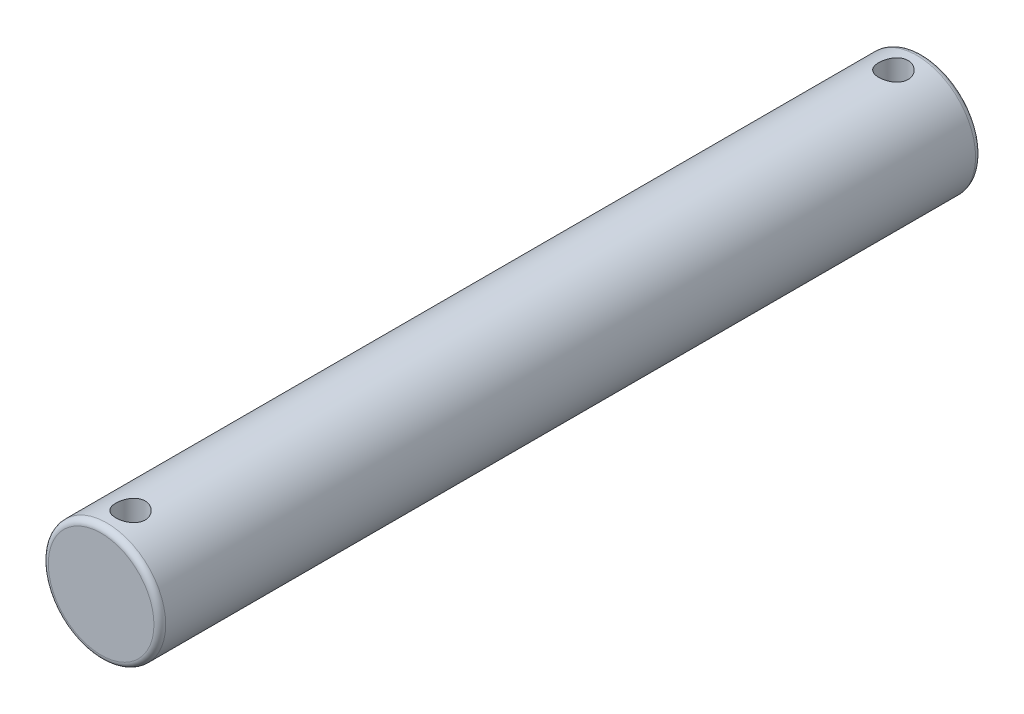
ISO-10303-21;
HEADER;
FILE_DESCRIPTION(('STEP AP214'),'2;1');
FILE_NAME('part.step','',(''),(''),'','','');
FILE_SCHEMA(('AUTOMOTIVE_DESIGN { 1 0 10303 214 1 1 1 1 }'));
ENDSEC;
DATA;
#1=APPLICATION_CONTEXT('core data for automotive mechanical design processes');
#2=APPLICATION_PROTOCOL_DEFINITION('international standard','automotive_design',2000,#1);
#3=PRODUCT_CONTEXT('',#1,'mechanical');
#4=PRODUCT('Part','Part','',(#3));
#5=PRODUCT_RELATED_PRODUCT_CATEGORY('part','',(#4));
#6=PRODUCT_DEFINITION_FORMATION('','',#4);
#7=PRODUCT_DEFINITION_CONTEXT('part definition',#1,'design');
#8=PRODUCT_DEFINITION('design','',#6,#7);
#9=PRODUCT_DEFINITION_SHAPE('','',#8);
#10=(LENGTH_UNIT() NAMED_UNIT(*) SI_UNIT(.MILLI.,.METRE.));
#11=(NAMED_UNIT(*) PLANE_ANGLE_UNIT() SI_UNIT($,.RADIAN.));
#12=(NAMED_UNIT(*) SI_UNIT($,.STERADIAN.) SOLID_ANGLE_UNIT());
#13=UNCERTAINTY_MEASURE_WITH_UNIT(LENGTH_MEASURE(1.E-05),#10,'distance_accuracy_value','');
#14=(GEOMETRIC_REPRESENTATION_CONTEXT(3) GLOBAL_UNCERTAINTY_ASSIGNED_CONTEXT((#13)) GLOBAL_UNIT_ASSIGNED_CONTEXT((#10,
#11,#12)) REPRESENTATION_CONTEXT('',''));
#15=CARTESIAN_POINT('',(0.,0.,0.));
#16=DIRECTION('',(0.,0.,1.));
#17=DIRECTION('',(1.,0.,0.));
#18=AXIS2_PLACEMENT_3D('',#15,#16,#17);
#19=CARTESIAN_POINT('',(0.,0.,140.));
#20=DIRECTION('',(0.,0.,-1.));
#21=DIRECTION('',(-1.,0.,0.));
#22=AXIS2_PLACEMENT_3D('',#19,#20,#21);
#23=CYLINDRICAL_SURFACE('',#22,10.);
#24=CARTESIAN_POINT('',(0.,0.,1.));
#25=DIRECTION('',(0.,0.,1.));
#26=DIRECTION('',(1.,0.,0.));
#27=AXIS2_PLACEMENT_3D('',#24,#25,#26);
#28=CIRCLE('',#27,10.);
#29=CARTESIAN_POINT('',(10.,0.,1.));
#30=VERTEX_POINT('',#29);
#31=EDGE_CURVE('E59',#30,#30,#28,.T.);
#32=ORIENTED_EDGE('',*,*,#31,.T.);
#33=EDGE_LOOP('',(#32));
#34=FACE_BOUND('',#33,.T.);
#35=CARTESIAN_POINT('',(0.,0.,139.));
#36=DIRECTION('',(0.,0.,1.));
#37=DIRECTION('',(1.,0.,0.));
#38=AXIS2_PLACEMENT_3D('',#35,#36,#37);
#39=CIRCLE('',#38,10.);
#40=CARTESIAN_POINT('',(10.,0.,139.));
#41=VERTEX_POINT('',#40);
#42=EDGE_CURVE('E105',#41,#41,#39,.F.);
#43=ORIENTED_EDGE('',*,*,#42,.T.);
#44=EDGE_LOOP('',(#43));
#45=FACE_BOUND('',#44,.T.);
#46=CARTESIAN_POINT('',(0.,-10.,132.5));
#47=CARTESIAN_POINT('',(0.138126814449551,-9.99999766446687,132.50000387623));
#48=CARTESIAN_POINT('',(0.276296929717937,-9.99710963553043,132.511485917956));
#49=CARTESIAN_POINT('',(0.54867720628422,-9.98586856383157,132.557041918845));
#50=CARTESIAN_POINT('',(0.682885078117898,-9.97751242366627,132.591128682563));
#51=CARTESIAN_POINT('',(0.943368120304289,-9.9562604388672,132.680732089103));
#52=CARTESIAN_POINT('',(1.06965260571666,-9.94337004736764,132.736222997859));
#53=CARTESIAN_POINT('',(1.3111202198407,-9.91442239679369,132.866968983408));
#54=CARTESIAN_POINT('',(1.4263029739146,-9.89836503090261,132.942224726865));
#55=CARTESIAN_POINT('',(1.64466987883486,-9.86445689319489,133.11200131609));
#56=CARTESIAN_POINT('',(1.74759281676842,-9.84657845246877,133.206852624932));
#57=CARTESIAN_POINT('',(1.93624821200553,-9.81122700196561,133.412420341515));
#58=CARTESIAN_POINT('',(2.02197872824865,-9.79375403816446,133.523138538245));
#59=CARTESIAN_POINT('',(2.17504423799828,-9.76091292830281,133.759325377895));
#60=CARTESIAN_POINT('',(2.24208702654189,-9.74557990774685,133.884988718015));
#61=CARTESIAN_POINT('',(2.35399484758457,-9.71915824696694,134.146247352767));
#62=CARTESIAN_POINT('',(2.39886342573357,-9.70806892824031,134.281841055553));
#63=CARTESIAN_POINT('',(2.46425806134127,-9.69167461160538,134.556239163669));
#64=CARTESIAN_POINT('',(2.48525378055342,-9.68625818328352,134.69492482673));
#65=CARTESIAN_POINT('',(2.50376962511068,-9.68148937432652,134.973947614999));
#66=CARTESIAN_POINT('',(2.50129356969686,-9.68213600713214,135.11428446782));
#67=CARTESIAN_POINT('',(2.47331087439951,-9.68932009194695,135.389026346242));
#68=CARTESIAN_POINT('',(2.44836390031772,-9.69571438345489,135.523492702442));
#69=CARTESIAN_POINT('',(2.37704031150499,-9.71344516118448,135.786268418185));
#70=CARTESIAN_POINT('',(2.33066217011567,-9.72478199948731,135.914577338382));
#71=CARTESIAN_POINT('',(2.21731579656199,-9.75125189842765,136.162896693754));
#72=CARTESIAN_POINT('',(2.15014444538822,-9.76642212449693,136.282810286316));
#73=CARTESIAN_POINT('',(1.99726046002493,-9.79882851409985,136.509864516261));
#74=CARTESIAN_POINT('',(1.91154458134808,-9.81606503891046,136.617002913445));
#75=CARTESIAN_POINT('',(1.72110570780206,-9.85126467566485,136.818672692824));
#76=CARTESIAN_POINT('',(1.61591043027646,-9.86923449130001,136.912757483436));
#77=CARTESIAN_POINT('',(1.3910198625062,-9.90343275964593,137.082035404106));
#78=CARTESIAN_POINT('',(1.27132412951326,-9.91966115915679,137.157227957106));
#79=CARTESIAN_POINT('',(1.02019314780232,-9.94862886823651,137.286750977041));
#80=CARTESIAN_POINT('',(0.88871898868104,-9.96135600212879,137.341008900424));
#81=CARTESIAN_POINT('',(0.618126680238133,-9.98179861652361,137.426528842849));
#82=CARTESIAN_POINT('',(0.479009998584134,-9.98951505565468,137.457795260697));
#83=CARTESIAN_POINT('',(0.200899950650036,-9.99892498785624,137.495762609265));
#84=CARTESIAN_POINT('',(0.0619945333136756,-10.0007675584713,137.503071710126));
#85=CARTESIAN_POINT('',(-0.215054791335852,-9.99864674690754,137.494584996574));
#86=CARTESIAN_POINT('',(-0.353198766074329,-9.99468388736421,137.478791262001));
#87=CARTESIAN_POINT('',(-0.622690447960822,-9.98149301878918,137.425048486014));
#88=CARTESIAN_POINT('',(-0.754108531614593,-9.97234390309647,137.387431227538));
#89=CARTESIAN_POINT('',(-1.00876215408754,-9.94981177723595,137.291488193286));
#90=CARTESIAN_POINT('',(-1.13199686505443,-9.93642833949965,137.233160326145));
#91=CARTESIAN_POINT('',(-1.36920522404971,-9.9065551321037,137.096273118542));
#92=CARTESIAN_POINT('',(-1.48297573639292,-9.89001445611,137.017373146006));
#93=CARTESIAN_POINT('',(-1.6958776894055,-9.85574181979587,136.842016818671));
#94=CARTESIAN_POINT('',(-1.79500659828873,-9.83800965421578,136.745557433971));
#95=CARTESIAN_POINT('',(-1.97831761345413,-9.80281594932498,136.534996731927));
#96=CARTESIAN_POINT('',(-2.06207311270183,-9.78537173637463,136.420520495001));
#97=CARTESIAN_POINT('',(-2.20918459835604,-9.75321463970069,136.178778942552));
#98=CARTESIAN_POINT('',(-2.27254149026901,-9.73850163474941,136.051514195049));
#99=CARTESIAN_POINT('',(-2.37658570101224,-9.71363491194665,135.788490462656));
#100=CARTESIAN_POINT('',(-2.41740732773931,-9.70345425375809,135.652787286146));
#101=CARTESIAN_POINT('',(-2.47557609990489,-9.68877906706586,135.376150603575));
#102=CARTESIAN_POINT('',(-2.49292837912652,-9.68428329504044,135.235218248298));
#103=CARTESIAN_POINT('',(-2.50339765056083,-9.68158168701612,134.956464960231));
#104=CARTESIAN_POINT('',(-2.49719649630132,-9.68319887888034,134.818670941456));
#105=CARTESIAN_POINT('',(-2.46229546385366,-9.69213181672143,134.546160185556));
#106=CARTESIAN_POINT('',(-2.43359603781099,-9.69944744817731,134.411443386645));
#107=CARTESIAN_POINT('',(-2.35488553240495,-9.71885434473222,134.149652568224));
#108=CARTESIAN_POINT('',(-2.30500234113404,-9.73091692061057,134.022537824599));
#109=CARTESIAN_POINT('',(-2.18544152267504,-9.7584625954084,133.778391028811));
#110=CARTESIAN_POINT('',(-2.11576115005696,-9.77394616867808,133.661360378022));
#111=CARTESIAN_POINT('',(-1.95644624772859,-9.80709390439337,133.437408951663));
#112=CARTESIAN_POINT('',(-1.86633860485377,-9.82480441386302,133.330831544293));
#113=CARTESIAN_POINT('',(-1.66964895198288,-9.86013378743769,133.134088258674));
#114=CARTESIAN_POINT('',(-1.56306303543523,-9.87775262878422,133.043926283145));
#115=CARTESIAN_POINT('',(-1.33411264450431,-9.91129426079449,132.880981152392));
#116=CARTESIAN_POINT('',(-1.21149737052731,-9.92718055609783,132.808542310547));
#117=CARTESIAN_POINT('',(-0.955443432517468,-9.95508208291861,132.685420895099));
#118=CARTESIAN_POINT('',(-0.822012605727906,-9.96710008666301,132.634722732252));
#119=CARTESIAN_POINT('',(-0.574017088739129,-9.98413432609236,132.564046949451));
#120=CARTESIAN_POINT('',(-0.460633618180125,-9.99004308421151,132.540081261578));
#121=CARTESIAN_POINT('',(-0.231510119227147,-9.9979767538658,132.50805676063));
#122=CARTESIAN_POINT('',(-0.115770268737698,-10.0000019575149,132.499996751158));
#123=CARTESIAN_POINT('',(0.,-10.,132.5));
#124=B_SPLINE_CURVE_WITH_KNOTS('',3,(#46,#47,#48,#49,#50,#51,#52,#53,#54,#55,#56,#57,#58,#59,
#60,#61,#62,#63,#64,#65,#66,#67,#68,#69,#70,#71,#72,#73,#74,#75,#76,#77,#78,#79,#80,#81,#82,#83,
#84,#85,#86,#87,#88,#89,#90,#91,#92,#93,#94,#95,#96,#97,#98,#99,#100,#101,#102,#103,#104,#105,
#106,#107,#108,#109,#110,#111,#112,#113,#114,#115,#116,#117,#118,#119,#120,#121,#122,#123),
.UNSPECIFIED.,.T.,.F.,(4,2,2,2,2,2,2,2,2,2,2,2,2,2,2,2,2,2,2,2,2,2,2,2,2,2,2,2,2,2,2,2,2,2,2,2,
2,2,4),(0.,0.413956187453146,0.828147062939834,1.24184150381016,1.65554990028221,
2.07690725728564,2.4983121596677,2.92597745909673,3.35357435282281,3.77260491835115,
4.19156730193363,4.6003749501723,5.0092117244893,5.42217546461997,5.83521151399138,
6.26002501620561,6.68485149269279,7.11113715020726,7.53734122819941,7.95263848254329,
8.3678983519344,8.77700457528932,9.18615212209352,9.60255979281118,10.0190393835223,
10.4457418201299,10.8724253125472,11.2965375769764,11.7205570543047,12.1323963400749,
12.5442273493652,12.9536066760888,13.3630428023797,13.7831596069298,14.2033761629383,
14.6312030917578,15.0587227304538,15.4057040491338,15.752659267482),.UNSPECIFIED.);
#125=CARTESIAN_POINT('',(0.,-10.,132.5));
#126=VERTEX_POINT('',#125);
#127=EDGE_CURVE('E63',#126,#126,#124,.T.);
#128=ORIENTED_EDGE('',*,*,#127,.F.);
#129=EDGE_LOOP('',(#128));
#130=FACE_BOUND('',#129,.T.);
#131=CARTESIAN_POINT('',(0.,10.,132.5));
#132=CARTESIAN_POINT('',(-0.138126814449551,9.99999766446687,132.50000387623));
#133=CARTESIAN_POINT('',(-0.276296929717937,9.99710963553043,132.511485917956));
#134=CARTESIAN_POINT('',(-0.54867720628422,9.98586856383157,132.557041918845));
#135=CARTESIAN_POINT('',(-0.682885078117898,9.97751242366627,132.591128682563));
#136=CARTESIAN_POINT('',(-0.943368120304289,9.9562604388672,132.680732089103));
#137=CARTESIAN_POINT('',(-1.06965260571666,9.94337004736764,132.736222997859));
#138=CARTESIAN_POINT('',(-1.3111202198407,9.91442239679369,132.866968983408));
#139=CARTESIAN_POINT('',(-1.4263029739146,9.89836503090261,132.942224726865));
#140=CARTESIAN_POINT('',(-1.64466987883486,9.86445689319489,133.11200131609));
#141=CARTESIAN_POINT('',(-1.74759281676842,9.84657845246877,133.206852624932));
#142=CARTESIAN_POINT('',(-1.93624821200553,9.81122700196561,133.412420341515));
#143=CARTESIAN_POINT('',(-2.02197872824865,9.79375403816446,133.523138538245));
#144=CARTESIAN_POINT('',(-2.17504423799828,9.76091292830281,133.759325377895));
#145=CARTESIAN_POINT('',(-2.24208702654189,9.74557990774685,133.884988718015));
#146=CARTESIAN_POINT('',(-2.35399484758457,9.71915824696694,134.146247352767));
#147=CARTESIAN_POINT('',(-2.39886342573357,9.70806892824031,134.281841055553));
#148=CARTESIAN_POINT('',(-2.46425806134127,9.69167461160538,134.556239163669));
#149=CARTESIAN_POINT('',(-2.48525378055342,9.68625818328352,134.69492482673));
#150=CARTESIAN_POINT('',(-2.50376962511068,9.68148937432652,134.973947614999));
#151=CARTESIAN_POINT('',(-2.50129356969686,9.68213600713214,135.11428446782));
#152=CARTESIAN_POINT('',(-2.47331087439951,9.68932009194695,135.389026346242));
#153=CARTESIAN_POINT('',(-2.44836390031772,9.69571438345489,135.523492702442));
#154=CARTESIAN_POINT('',(-2.37704031150499,9.71344516118448,135.786268418185));
#155=CARTESIAN_POINT('',(-2.33066217011567,9.72478199948731,135.914577338382));
#156=CARTESIAN_POINT('',(-2.21731579656199,9.75125189842765,136.162896693754));
#157=CARTESIAN_POINT('',(-2.15014444538822,9.76642212449693,136.282810286316));
#158=CARTESIAN_POINT('',(-1.99726046002493,9.79882851409985,136.509864516261));
#159=CARTESIAN_POINT('',(-1.91154458134808,9.81606503891046,136.617002913445));
#160=CARTESIAN_POINT('',(-1.72110570780206,9.85126467566485,136.818672692824));
#161=CARTESIAN_POINT('',(-1.61591043027646,9.86923449130001,136.912757483436));
#162=CARTESIAN_POINT('',(-1.3910198625062,9.90343275964593,137.082035404106));
#163=CARTESIAN_POINT('',(-1.27132412951326,9.91966115915679,137.157227957106));
#164=CARTESIAN_POINT('',(-1.02019314780232,9.94862886823651,137.286750977041));
#165=CARTESIAN_POINT('',(-0.88871898868104,9.96135600212879,137.341008900424));
#166=CARTESIAN_POINT('',(-0.618126680238133,9.98179861652361,137.426528842849));
#167=CARTESIAN_POINT('',(-0.479009998584134,9.98951505565468,137.457795260697));
#168=CARTESIAN_POINT('',(-0.200899950650036,9.99892498785624,137.495762609265));
#169=CARTESIAN_POINT('',(-0.0619945333136756,10.0007675584713,137.503071710126));
#170=CARTESIAN_POINT('',(0.215054791335852,9.99864674690754,137.494584996574));
#171=CARTESIAN_POINT('',(0.353198766074329,9.99468388736421,137.478791262001));
#172=CARTESIAN_POINT('',(0.622690447960822,9.98149301878918,137.425048486014));
#173=CARTESIAN_POINT('',(0.754108531614593,9.97234390309647,137.387431227538));
#174=CARTESIAN_POINT('',(1.00876215408754,9.94981177723595,137.291488193286));
#175=CARTESIAN_POINT('',(1.13199686505443,9.93642833949965,137.233160326145));
#176=CARTESIAN_POINT('',(1.36920522404971,9.9065551321037,137.096273118542));
#177=CARTESIAN_POINT('',(1.48297573639292,9.89001445611,137.017373146006));
#178=CARTESIAN_POINT('',(1.6958776894055,9.85574181979587,136.842016818671));
#179=CARTESIAN_POINT('',(1.79500659828873,9.83800965421578,136.745557433971));
#180=CARTESIAN_POINT('',(1.97831761345413,9.80281594932498,136.534996731927));
#181=CARTESIAN_POINT('',(2.06207311270183,9.78537173637463,136.420520495001));
#182=CARTESIAN_POINT('',(2.20918459835604,9.75321463970069,136.178778942552));
#183=CARTESIAN_POINT('',(2.27254149026901,9.73850163474941,136.051514195049));
#184=CARTESIAN_POINT('',(2.37658570101224,9.71363491194665,135.788490462656));
#185=CARTESIAN_POINT('',(2.41740732773931,9.70345425375809,135.652787286146));
#186=CARTESIAN_POINT('',(2.47557609990489,9.68877906706586,135.376150603575));
#187=CARTESIAN_POINT('',(2.49292837912652,9.68428329504044,135.235218248298));
#188=CARTESIAN_POINT('',(2.50339765056083,9.68158168701612,134.956464960231));
#189=CARTESIAN_POINT('',(2.49719649630132,9.68319887888034,134.818670941456));
#190=CARTESIAN_POINT('',(2.46229546385366,9.69213181672143,134.546160185556));
#191=CARTESIAN_POINT('',(2.43359603781099,9.69944744817731,134.411443386645));
#192=CARTESIAN_POINT('',(2.35488553240495,9.71885434473222,134.149652568224));
#193=CARTESIAN_POINT('',(2.30500234113404,9.73091692061057,134.022537824599));
#194=CARTESIAN_POINT('',(2.18544152267504,9.7584625954084,133.778391028811));
#195=CARTESIAN_POINT('',(2.11576115005696,9.77394616867808,133.661360378022));
#196=CARTESIAN_POINT('',(1.95644624772859,9.80709390439337,133.437408951663));
#197=CARTESIAN_POINT('',(1.86633860485377,9.82480441386302,133.330831544293));
#198=CARTESIAN_POINT('',(1.66964895198288,9.86013378743769,133.134088258674));
#199=CARTESIAN_POINT('',(1.56306303543523,9.87775262878422,133.043926283145));
#200=CARTESIAN_POINT('',(1.33411264450431,9.91129426079449,132.880981152392));
#201=CARTESIAN_POINT('',(1.21149737052731,9.92718055609783,132.808542310547));
#202=CARTESIAN_POINT('',(0.955443432517468,9.95508208291861,132.685420895099));
#203=CARTESIAN_POINT('',(0.822012605727906,9.96710008666301,132.634722732252));
#204=CARTESIAN_POINT('',(0.574017088739129,9.98413432609236,132.564046949451));
#205=CARTESIAN_POINT('',(0.460633618180125,9.99004308421151,132.540081261578));
#206=CARTESIAN_POINT('',(0.231510119227147,9.9979767538658,132.50805676063));
#207=CARTESIAN_POINT('',(0.115770268737698,10.0000019575149,132.499996751158));
#208=CARTESIAN_POINT('',(0.,10.,132.5));
#209=B_SPLINE_CURVE_WITH_KNOTS('',3,(#131,#132,#133,#134,#135,#136,#137,#138,#139,#140,#141,
#142,#143,#144,#145,#146,#147,#148,#149,#150,#151,#152,#153,#154,#155,#156,#157,#158,#159,#160,
#161,#162,#163,#164,#165,#166,#167,#168,#169,#170,#171,#172,#173,#174,#175,#176,#177,#178,#179,
#180,#181,#182,#183,#184,#185,#186,#187,#188,#189,#190,#191,#192,#193,#194,#195,#196,#197,#198,
#199,#200,#201,#202,#203,#204,#205,#206,#207,#208),.UNSPECIFIED.,.T.,.F.,(4,2,2,2,2,2,2,2,2,2,2,
2,2,2,2,2,2,2,2,2,2,2,2,2,2,2,2,2,2,2,2,2,2,2,2,2,2,2,4),(0.,0.413956187453146,
0.828147062939834,1.24184150381016,1.65554990028221,2.07690725728564,2.4983121596677,
2.92597745909673,3.35357435282281,3.77260491835115,4.19156730193363,4.6003749501723,
5.0092117244893,5.42217546461997,5.83521151399138,6.26002501620561,6.68485149269279,
7.11113715020726,7.53734122819941,7.95263848254329,8.3678983519344,8.77700457528932,
9.18615212209352,9.60255979281118,10.0190393835223,10.4457418201299,10.8724253125472,
11.2965375769764,11.7205570543047,12.1323963400749,12.5442273493652,12.9536066760888,
13.3630428023797,13.7831596069298,14.2033761629383,14.6312030917578,15.0587227304538,
15.4057040491338,15.752659267482),.UNSPECIFIED.);
#210=CARTESIAN_POINT('',(0.,10.,132.5));
#211=VERTEX_POINT('',#210);
#212=EDGE_CURVE('E71',#211,#211,#209,.T.);
#213=ORIENTED_EDGE('',*,*,#212,.F.);
#214=EDGE_LOOP('',(#213));
#215=FACE_BOUND('',#214,.T.);
#216=CARTESIAN_POINT('',(0.,-10.,2.5));
#217=CARTESIAN_POINT('',(0.138126814449552,-9.99999766446687,2.50000387623026));
#218=CARTESIAN_POINT('',(0.276296929717939,-9.99710963553044,2.51148591795631));
#219=CARTESIAN_POINT('',(0.548677206284221,-9.98586856383157,2.55704191884501));
#220=CARTESIAN_POINT('',(0.682885078117899,-9.97751242366627,2.59112868256308));
#221=CARTESIAN_POINT('',(0.943368120304295,-9.9562604388672,2.68073208910348));
#222=CARTESIAN_POINT('',(1.06965260571667,-9.94337004736764,2.73622299785878));
#223=CARTESIAN_POINT('',(1.31112021984071,-9.91442239679369,2.86696898340807));
#224=CARTESIAN_POINT('',(1.42630297391461,-9.89836503090261,2.94222472686495));
#225=CARTESIAN_POINT('',(1.64466987883486,-9.86445689319489,3.1120013160903));
#226=CARTESIAN_POINT('',(1.74759281676843,-9.84657845246877,3.20685262493177));
#227=CARTESIAN_POINT('',(1.93624821200553,-9.8112270019656,3.41242034151506));
#228=CARTESIAN_POINT('',(2.02197872824865,-9.79375403816446,3.52313853824489));
#229=CARTESIAN_POINT('',(2.17504423799829,-9.76091292830281,3.75932537789498));
#230=CARTESIAN_POINT('',(2.2420870265419,-9.74557990774685,3.88498871801455));
#231=CARTESIAN_POINT('',(2.35399484758457,-9.71915824696694,4.14624735276672));
#232=CARTESIAN_POINT('',(2.39886342573357,-9.70806892824031,4.28184105555336));
#233=CARTESIAN_POINT('',(2.46425806134127,-9.69167461160538,4.55623916366943));
#234=CARTESIAN_POINT('',(2.48525378055342,-9.68625818328352,4.69492482672999));
#235=CARTESIAN_POINT('',(2.50376962511068,-9.68148937432652,4.97394761499891));
#236=CARTESIAN_POINT('',(2.50129356969685,-9.68213600713214,5.11428446782023));
#237=CARTESIAN_POINT('',(2.47331087439951,-9.68932009194695,5.38902634624226));
#238=CARTESIAN_POINT('',(2.44836390031772,-9.69571438345489,5.52349270244222));
#239=CARTESIAN_POINT('',(2.37704031150499,-9.71344516118448,5.7862684181851));
#240=CARTESIAN_POINT('',(2.33066217011565,-9.72478199948731,5.91457733838154));
#241=CARTESIAN_POINT('',(2.21731579656198,-9.75125189842765,6.16289669375355));
#242=CARTESIAN_POINT('',(2.1501444453882,-9.76642212449693,6.28281028631595));
#243=CARTESIAN_POINT('',(1.99726046002491,-9.79882851409985,6.50986451626137));
#244=CARTESIAN_POINT('',(1.91154458134806,-9.81606503891047,6.61700291344542));
#245=CARTESIAN_POINT('',(1.72110570780203,-9.85126467566485,6.81867269282401));
#246=CARTESIAN_POINT('',(1.61591043027643,-9.86923449130002,6.91275748343559));
#247=CARTESIAN_POINT('',(1.39101986250617,-9.90343275964594,7.08203540410651));
#248=CARTESIAN_POINT('',(1.27132412951324,-9.91966115915679,7.15722795710594));
#249=CARTESIAN_POINT('',(1.02019314780232,-9.94862886823651,7.28675097704064));
#250=CARTESIAN_POINT('',(0.888718988681039,-9.96135600212879,7.34100890042405));
#251=CARTESIAN_POINT('',(0.618126680238138,-9.98179861652361,7.42652884284929));
#252=CARTESIAN_POINT('',(0.479009998584141,-9.98951505565468,7.4577952606969));
#253=CARTESIAN_POINT('',(0.200899950650044,-9.99892498785624,7.49576260926473));
#254=CARTESIAN_POINT('',(0.0619945333136829,-10.0007675584713,7.50307171012551));
#255=CARTESIAN_POINT('',(-0.215054791335848,-9.99864674690754,7.49458499657419));
#256=CARTESIAN_POINT('',(-0.353198766074327,-9.99468388736421,7.47879126200144));
#257=CARTESIAN_POINT('',(-0.622690447960818,-9.98149301878918,7.42504848601437));
#258=CARTESIAN_POINT('',(-0.754108531614584,-9.97234390309647,7.38743122753838));
#259=CARTESIAN_POINT('',(-1.00876215408753,-9.94981177723595,7.2914881932859));
#260=CARTESIAN_POINT('',(-1.13199686505442,-9.93642833949965,7.23316032614463));
#261=CARTESIAN_POINT('',(-1.36920522404972,-9.9065551321037,7.09627311854221));
#262=CARTESIAN_POINT('',(-1.48297573639294,-9.89001445610999,7.01737314600573));
#263=CARTESIAN_POINT('',(-1.69587768940552,-9.85574181979586,6.84201681867139));
#264=CARTESIAN_POINT('',(-1.79500659828875,-9.83800965421578,6.74555743397059));
#265=CARTESIAN_POINT('',(-1.97831761345414,-9.80281594932498,6.53499673192716));
#266=CARTESIAN_POINT('',(-2.06207311270184,-9.78537173637463,6.42052049500073));
#267=CARTESIAN_POINT('',(-2.20918459835604,-9.75321463970069,6.17877894255237));
#268=CARTESIAN_POINT('',(-2.27254149026901,-9.73850163474941,6.05151419504926));
#269=CARTESIAN_POINT('',(-2.37658570101223,-9.71363491194665,5.78849046265627));
#270=CARTESIAN_POINT('',(-2.41740732773931,-9.70345425375809,5.65278728614617));
#271=CARTESIAN_POINT('',(-2.47557609990489,-9.68877906706585,5.37615060357451));
#272=CARTESIAN_POINT('',(-2.49292837912652,-9.68428329504044,5.23521824829759));
#273=CARTESIAN_POINT('',(-2.50339765056083,-9.68158168701612,4.95646496023065));
#274=CARTESIAN_POINT('',(-2.49719649630131,-9.68319887888035,4.81867094145592));
#275=CARTESIAN_POINT('',(-2.46229546385366,-9.69213181672143,4.54616018555623));
#276=CARTESIAN_POINT('',(-2.43359603781098,-9.69944744817731,4.41144338664468));
#277=CARTESIAN_POINT('',(-2.35488553240495,-9.71885434473222,4.14965256822356));
#278=CARTESIAN_POINT('',(-2.30500234113404,-9.73091692061057,4.02253782459945));
#279=CARTESIAN_POINT('',(-2.18544152267504,-9.7584625954084,3.77839102881072));
#280=CARTESIAN_POINT('',(-2.11576115005696,-9.77394616867808,3.66136037802186));
#281=CARTESIAN_POINT('',(-1.95644624772858,-9.80709390439337,3.43740895166324));
#282=CARTESIAN_POINT('',(-1.86633860485376,-9.82480441386302,3.33083154429339));
#283=CARTESIAN_POINT('',(-1.66964895198289,-9.86013378743769,3.13408825867434));
#284=CARTESIAN_POINT('',(-1.56306303543524,-9.87775262878422,3.04392628314506));
#285=CARTESIAN_POINT('',(-1.33411264450432,-9.91129426079449,2.88098115239232));
#286=CARTESIAN_POINT('',(-1.21149737052731,-9.92718055609783,2.80854231054737));
#287=CARTESIAN_POINT('',(-0.95544343251746,-9.95508208291861,2.68542089509912));
#288=CARTESIAN_POINT('',(-0.8220126057279,-9.96710008666301,2.63472273225244));
#289=CARTESIAN_POINT('',(-0.57401708873912,-9.98413432609236,2.56404694945058));
#290=CARTESIAN_POINT('',(-0.460633618180115,-9.99004308421151,2.54008126157761));
#291=CARTESIAN_POINT('',(-0.231510119227139,-9.9979767538658,2.5080567606301));
#292=CARTESIAN_POINT('',(-0.115770268737694,-10.0000019575149,2.49999675115783));
#293=CARTESIAN_POINT('',(0.,-10.,2.5));
#294=B_SPLINE_CURVE_WITH_KNOTS('',3,(#216,#217,#218,#219,#220,#221,#222,#223,#224,#225,#226,
#227,#228,#229,#230,#231,#232,#233,#234,#235,#236,#237,#238,#239,#240,#241,#242,#243,#244,#245,
#246,#247,#248,#249,#250,#251,#252,#253,#254,#255,#256,#257,#258,#259,#260,#261,#262,#263,#264,
#265,#266,#267,#268,#269,#270,#271,#272,#273,#274,#275,#276,#277,#278,#279,#280,#281,#282,#283,
#284,#285,#286,#287,#288,#289,#290,#291,#292,#293),.UNSPECIFIED.,.T.,.F.,(4,2,2,2,2,2,2,2,2,2,2,
2,2,2,2,2,2,2,2,2,2,2,2,2,2,2,2,2,2,2,2,2,2,2,2,2,2,2,4),(0.,0.41395618745315,0.828147062939833,
1.24184150381018,1.65554990028221,2.07690725728565,2.4983121596677,2.92597745909678,
3.35357435282281,3.77260491835116,4.19156730193363,4.60037495017231,5.00921172448932,
5.42217546462,5.83521151399139,6.26002501620567,6.6848514926928,7.11113715020725,
7.53734122819939,7.95263848254328,8.36789835193439,8.7770045752893,9.18615212209352,
9.60255979281122,10.0190393835223,10.4457418201299,10.8724253125471,11.2965375769764,
11.7205570543048,12.1323963400748,12.5442273493652,12.9536066760888,13.3630428023797,
13.7831596069298,14.2033761629383,14.6312030917578,15.0587227304538,15.4057040491338,
15.752659267482),.UNSPECIFIED.);
#295=CARTESIAN_POINT('',(0.,-10.,2.5));
#296=VERTEX_POINT('',#295);
#297=EDGE_CURVE('E114',#296,#296,#294,.T.);
#298=ORIENTED_EDGE('',*,*,#297,.F.);
#299=EDGE_LOOP('',(#298));
#300=FACE_BOUND('',#299,.T.);
#301=CARTESIAN_POINT('',(0.,10.,2.5));
#302=CARTESIAN_POINT('',(-0.138126814449552,9.99999766446687,2.50000387623026));
#303=CARTESIAN_POINT('',(-0.276296929717939,9.99710963553044,2.51148591795631));
#304=CARTESIAN_POINT('',(-0.548677206284221,9.98586856383157,2.55704191884501));
#305=CARTESIAN_POINT('',(-0.682885078117899,9.97751242366627,2.59112868256308));
#306=CARTESIAN_POINT('',(-0.943368120304295,9.9562604388672,2.68073208910348));
#307=CARTESIAN_POINT('',(-1.06965260571667,9.94337004736764,2.73622299785878));
#308=CARTESIAN_POINT('',(-1.31112021984071,9.91442239679369,2.86696898340807));
#309=CARTESIAN_POINT('',(-1.42630297391461,9.89836503090261,2.94222472686495));
#310=CARTESIAN_POINT('',(-1.64466987883486,9.86445689319489,3.1120013160903));
#311=CARTESIAN_POINT('',(-1.74759281676843,9.84657845246877,3.20685262493177));
#312=CARTESIAN_POINT('',(-1.93624821200553,9.8112270019656,3.41242034151506));
#313=CARTESIAN_POINT('',(-2.02197872824865,9.79375403816446,3.52313853824489));
#314=CARTESIAN_POINT('',(-2.17504423799829,9.76091292830281,3.75932537789498));
#315=CARTESIAN_POINT('',(-2.2420870265419,9.74557990774685,3.88498871801455));
#316=CARTESIAN_POINT('',(-2.35399484758457,9.71915824696694,4.14624735276672));
#317=CARTESIAN_POINT('',(-2.39886342573357,9.70806892824031,4.28184105555336));
#318=CARTESIAN_POINT('',(-2.46425806134127,9.69167461160538,4.55623916366943));
#319=CARTESIAN_POINT('',(-2.48525378055342,9.68625818328352,4.69492482672999));
#320=CARTESIAN_POINT('',(-2.50376962511068,9.68148937432652,4.97394761499891));
#321=CARTESIAN_POINT('',(-2.50129356969685,9.68213600713214,5.11428446782023));
#322=CARTESIAN_POINT('',(-2.47331087439951,9.68932009194695,5.38902634624226));
#323=CARTESIAN_POINT('',(-2.44836390031772,9.69571438345489,5.52349270244222));
#324=CARTESIAN_POINT('',(-2.37704031150499,9.71344516118448,5.7862684181851));
#325=CARTESIAN_POINT('',(-2.33066217011565,9.72478199948731,5.91457733838154));
#326=CARTESIAN_POINT('',(-2.21731579656198,9.75125189842765,6.16289669375355));
#327=CARTESIAN_POINT('',(-2.1501444453882,9.76642212449693,6.28281028631595));
#328=CARTESIAN_POINT('',(-1.99726046002491,9.79882851409985,6.50986451626137));
#329=CARTESIAN_POINT('',(-1.91154458134806,9.81606503891047,6.61700291344542));
#330=CARTESIAN_POINT('',(-1.72110570780203,9.85126467566485,6.81867269282401));
#331=CARTESIAN_POINT('',(-1.61591043027643,9.86923449130002,6.91275748343559));
#332=CARTESIAN_POINT('',(-1.39101986250617,9.90343275964594,7.08203540410651));
#333=CARTESIAN_POINT('',(-1.27132412951324,9.91966115915679,7.15722795710594));
#334=CARTESIAN_POINT('',(-1.02019314780232,9.94862886823651,7.28675097704064));
#335=CARTESIAN_POINT('',(-0.888718988681039,9.96135600212879,7.34100890042405));
#336=CARTESIAN_POINT('',(-0.618126680238138,9.98179861652361,7.42652884284929));
#337=CARTESIAN_POINT('',(-0.479009998584141,9.98951505565468,7.4577952606969));
#338=CARTESIAN_POINT('',(-0.200899950650044,9.99892498785624,7.49576260926473));
#339=CARTESIAN_POINT('',(-0.0619945333136829,10.0007675584713,7.50307171012551));
#340=CARTESIAN_POINT('',(0.215054791335848,9.99864674690754,7.49458499657419));
#341=CARTESIAN_POINT('',(0.353198766074327,9.99468388736421,7.47879126200144));
#342=CARTESIAN_POINT('',(0.622690447960818,9.98149301878918,7.42504848601437));
#343=CARTESIAN_POINT('',(0.754108531614584,9.97234390309647,7.38743122753838));
#344=CARTESIAN_POINT('',(1.00876215408753,9.94981177723595,7.2914881932859));
#345=CARTESIAN_POINT('',(1.13199686505442,9.93642833949965,7.23316032614463));
#346=CARTESIAN_POINT('',(1.36920522404972,9.9065551321037,7.09627311854221));
#347=CARTESIAN_POINT('',(1.48297573639294,9.89001445610999,7.01737314600573));
#348=CARTESIAN_POINT('',(1.69587768940552,9.85574181979586,6.84201681867139));
#349=CARTESIAN_POINT('',(1.79500659828875,9.83800965421578,6.74555743397059));
#350=CARTESIAN_POINT('',(1.97831761345414,9.80281594932498,6.53499673192716));
#351=CARTESIAN_POINT('',(2.06207311270184,9.78537173637463,6.42052049500073));
#352=CARTESIAN_POINT('',(2.20918459835604,9.75321463970069,6.17877894255237));
#353=CARTESIAN_POINT('',(2.27254149026901,9.73850163474941,6.05151419504926));
#354=CARTESIAN_POINT('',(2.37658570101223,9.71363491194665,5.78849046265627));
#355=CARTESIAN_POINT('',(2.41740732773931,9.70345425375809,5.65278728614617));
#356=CARTESIAN_POINT('',(2.47557609990489,9.68877906706585,5.37615060357451));
#357=CARTESIAN_POINT('',(2.49292837912652,9.68428329504044,5.23521824829759));
#358=CARTESIAN_POINT('',(2.50339765056083,9.68158168701612,4.95646496023065));
#359=CARTESIAN_POINT('',(2.49719649630131,9.68319887888035,4.81867094145592));
#360=CARTESIAN_POINT('',(2.46229546385366,9.69213181672143,4.54616018555623));
#361=CARTESIAN_POINT('',(2.43359603781098,9.69944744817731,4.41144338664468));
#362=CARTESIAN_POINT('',(2.35488553240495,9.71885434473222,4.14965256822356));
#363=CARTESIAN_POINT('',(2.30500234113404,9.73091692061057,4.02253782459945));
#364=CARTESIAN_POINT('',(2.18544152267504,9.7584625954084,3.77839102881072));
#365=CARTESIAN_POINT('',(2.11576115005696,9.77394616867808,3.66136037802186));
#366=CARTESIAN_POINT('',(1.95644624772858,9.80709390439337,3.43740895166324));
#367=CARTESIAN_POINT('',(1.86633860485376,9.82480441386302,3.33083154429339));
#368=CARTESIAN_POINT('',(1.66964895198289,9.86013378743769,3.13408825867434));
#369=CARTESIAN_POINT('',(1.56306303543524,9.87775262878422,3.04392628314506));
#370=CARTESIAN_POINT('',(1.33411264450432,9.91129426079449,2.88098115239232));
#371=CARTESIAN_POINT('',(1.21149737052731,9.92718055609783,2.80854231054737));
#372=CARTESIAN_POINT('',(0.95544343251746,9.95508208291861,2.68542089509912));
#373=CARTESIAN_POINT('',(0.8220126057279,9.96710008666301,2.63472273225244));
#374=CARTESIAN_POINT('',(0.57401708873912,9.98413432609236,2.56404694945058));
#375=CARTESIAN_POINT('',(0.460633618180115,9.99004308421151,2.54008126157761));
#376=CARTESIAN_POINT('',(0.231510119227139,9.9979767538658,2.5080567606301));
#377=CARTESIAN_POINT('',(0.115770268737694,10.0000019575149,2.49999675115783));
#378=CARTESIAN_POINT('',(0.,10.,2.5));
#379=B_SPLINE_CURVE_WITH_KNOTS('',3,(#301,#302,#303,#304,#305,#306,#307,#308,#309,#310,#311,
#312,#313,#314,#315,#316,#317,#318,#319,#320,#321,#322,#323,#324,#325,#326,#327,#328,#329,#330,
#331,#332,#333,#334,#335,#336,#337,#338,#339,#340,#341,#342,#343,#344,#345,#346,#347,#348,#349,
#350,#351,#352,#353,#354,#355,#356,#357,#358,#359,#360,#361,#362,#363,#364,#365,#366,#367,#368,
#369,#370,#371,#372,#373,#374,#375,#376,#377,#378),.UNSPECIFIED.,.T.,.F.,(4,2,2,2,2,2,2,2,2,2,2,
2,2,2,2,2,2,2,2,2,2,2,2,2,2,2,2,2,2,2,2,2,2,2,2,2,2,2,4),(0.,0.41395618745315,0.828147062939833,
1.24184150381018,1.65554990028221,2.07690725728565,2.4983121596677,2.92597745909678,
3.35357435282281,3.77260491835116,4.19156730193363,4.60037495017231,5.00921172448932,
5.42217546462,5.83521151399139,6.26002501620567,6.6848514926928,7.11113715020725,
7.53734122819939,7.95263848254328,8.36789835193439,8.7770045752893,9.18615212209352,
9.60255979281122,10.0190393835223,10.4457418201299,10.8724253125471,11.2965375769764,
11.7205570543048,12.1323963400748,12.5442273493652,12.9536066760888,13.3630428023797,
13.7831596069298,14.2033761629383,14.6312030917578,15.0587227304538,15.4057040491338,
15.752659267482),.UNSPECIFIED.);
#380=CARTESIAN_POINT('',(0.,10.,2.5));
#381=VERTEX_POINT('',#380);
#382=EDGE_CURVE('E43',#381,#381,#379,.T.);
#383=ORIENTED_EDGE('',*,*,#382,.F.);
#384=EDGE_LOOP('',(#383));
#385=FACE_BOUND('',#384,.T.);
#386=ADVANCED_FACE('F39',(#34,#45,#130,#215,#300,#385),#23,.T.);
#387=CARTESIAN_POINT('',(0.,0.,140.));
#388=DIRECTION('',(0.,0.,1.));
#389=DIRECTION('',(1.,0.,0.));
#390=AXIS2_PLACEMENT_3D('',#387,#388,#389);
#391=PLANE('',#390);
#392=CARTESIAN_POINT('',(0.,0.,140.));
#393=DIRECTION('',(0.,0.,1.));
#394=DIRECTION('',(1.,0.,0.));
#395=AXIS2_PLACEMENT_3D('',#392,#393,#394);
#396=CIRCLE('',#395,9.);
#397=CARTESIAN_POINT('',(9.,0.,140.));
#398=VERTEX_POINT('',#397);
#399=EDGE_CURVE('E10',#398,#398,#396,.T.);
#400=ORIENTED_EDGE('',*,*,#399,.T.);
#401=EDGE_LOOP('',(#400));
#402=FACE_BOUND('',#401,.T.);
#403=ADVANCED_FACE('F84',(#402),#391,.T.);
#404=CARTESIAN_POINT('',(0.,0.,0.));
#405=DIRECTION('',(0.,0.,1.));
#406=DIRECTION('',(1.,0.,0.));
#407=AXIS2_PLACEMENT_3D('',#404,#405,#406);
#408=PLANE('',#407);
#409=CARTESIAN_POINT('',(0.,0.,0.));
#410=DIRECTION('',(0.,0.,1.));
#411=DIRECTION('',(1.,0.,0.));
#412=AXIS2_PLACEMENT_3D('',#409,#410,#411);
#413=CIRCLE('',#412,9.);
#414=CARTESIAN_POINT('',(9.,0.,0.));
#415=VERTEX_POINT('',#414);
#416=EDGE_CURVE('E53',#415,#415,#413,.F.);
#417=ORIENTED_EDGE('',*,*,#416,.T.);
#418=EDGE_LOOP('',(#417));
#419=FACE_BOUND('',#418,.T.);
#420=ADVANCED_FACE('F87',(#419),#408,.F.);
#421=CARTESIAN_POINT('',(0.,0.,1.));
#422=DIRECTION('',(0.,0.,1.));
#423=DIRECTION('',(1.,0.,0.));
#424=AXIS2_PLACEMENT_3D('',#421,#422,#423);
#425=TOROIDAL_SURFACE('',#424,9.,1.);
#426=ORIENTED_EDGE('',*,*,#416,.F.);
#427=EDGE_LOOP('',(#426));
#428=FACE_BOUND('',#427,.T.);
#429=ORIENTED_EDGE('',*,*,#31,.F.);
#430=EDGE_LOOP('',(#429));
#431=FACE_BOUND('',#430,.T.);
#432=ADVANCED_FACE('F89',(#428,#431),#425,.T.);
#433=CARTESIAN_POINT('',(0.,0.,139.));
#434=DIRECTION('',(0.,0.,1.));
#435=DIRECTION('',(1.,0.,0.));
#436=AXIS2_PLACEMENT_3D('',#433,#434,#435);
#437=TOROIDAL_SURFACE('',#436,9.,1.);
#438=ORIENTED_EDGE('',*,*,#42,.F.);
#439=EDGE_LOOP('',(#438));
#440=FACE_BOUND('',#439,.T.);
#441=ORIENTED_EDGE('',*,*,#399,.F.);
#442=EDGE_LOOP('',(#441));
#443=FACE_BOUND('',#442,.T.);
#444=ADVANCED_FACE('F41',(#440,#443),#437,.T.);
#445=CARTESIAN_POINT('',(0.,140.,135.));
#446=DIRECTION('',(0.,-1.,0.));
#447=DIRECTION('',(0.,0.,-1.));
#448=AXIS2_PLACEMENT_3D('',#445,#446,#447);
#449=CYLINDRICAL_SURFACE('',#448,2.5);
#450=ORIENTED_EDGE('',*,*,#127,.T.);
#451=EDGE_LOOP('',(#450));
#452=FACE_BOUND('',#451,.T.);
#453=ORIENTED_EDGE('',*,*,#212,.T.);
#454=EDGE_LOOP('',(#453));
#455=FACE_BOUND('',#454,.T.);
#456=ADVANCED_FACE('F77',(#452,#455),#449,.F.);
#457=CARTESIAN_POINT('',(0.,140.,5.));
#458=DIRECTION('',(0.,-1.,0.));
#459=DIRECTION('',(0.,0.,-1.));
#460=AXIS2_PLACEMENT_3D('',#457,#458,#459);
#461=CYLINDRICAL_SURFACE('',#460,2.5);
#462=ORIENTED_EDGE('',*,*,#297,.T.);
#463=EDGE_LOOP('',(#462));
#464=FACE_BOUND('',#463,.T.);
#465=ORIENTED_EDGE('',*,*,#382,.T.);
#466=EDGE_LOOP('',(#465));
#467=FACE_BOUND('',#466,.T.);
#468=ADVANCED_FACE('F81',(#464,#467),#461,.F.);
#469=CLOSED_SHELL('',(#386,#403,#420,#432,#444,#456,#468));
#470=MANIFOLD_SOLID_BREP('B2',#469);
#471=ADVANCED_BREP_SHAPE_REPRESENTATION('',(#18,#470),#14);
#472=SHAPE_DEFINITION_REPRESENTATION(#9,#471);
ENDSEC;
END-ISO-10303-21;
